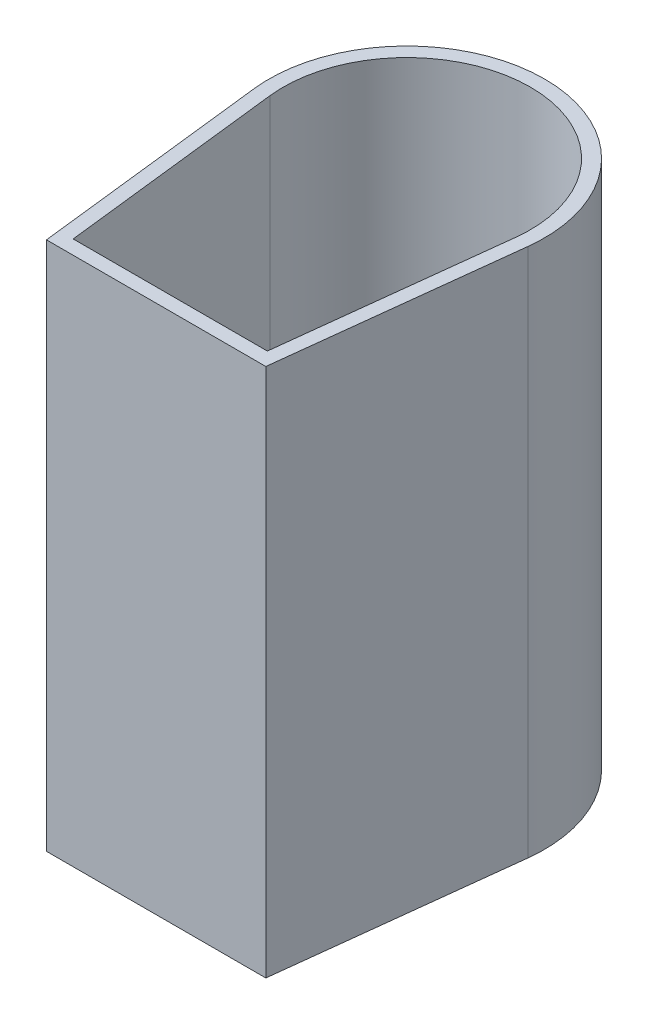
ISO-10303-21;
HEADER;
FILE_DESCRIPTION(('STEP AP214'),'2;1');
FILE_NAME('part.step','',(''),(''),'','','');
FILE_SCHEMA(('AUTOMOTIVE_DESIGN { 1 0 10303 214 1 1 1 1 }'));
ENDSEC;
DATA;
#1=APPLICATION_CONTEXT('core data for automotive mechanical design processes');
#2=APPLICATION_PROTOCOL_DEFINITION('international standard','automotive_design',2000,#1);
#3=PRODUCT_CONTEXT('',#1,'mechanical');
#4=PRODUCT('Part','Part','',(#3));
#5=PRODUCT_RELATED_PRODUCT_CATEGORY('part','',(#4));
#6=PRODUCT_DEFINITION_FORMATION('','',#4);
#7=PRODUCT_DEFINITION_CONTEXT('part definition',#1,'design');
#8=PRODUCT_DEFINITION('design','',#6,#7);
#9=PRODUCT_DEFINITION_SHAPE('','',#8);
#10=(LENGTH_UNIT() NAMED_UNIT(*) SI_UNIT(.MILLI.,.METRE.));
#11=(NAMED_UNIT(*) PLANE_ANGLE_UNIT() SI_UNIT($,.RADIAN.));
#12=(NAMED_UNIT(*) SI_UNIT($,.STERADIAN.) SOLID_ANGLE_UNIT());
#13=UNCERTAINTY_MEASURE_WITH_UNIT(LENGTH_MEASURE(1.E-05),#10,'distance_accuracy_value','');
#14=(GEOMETRIC_REPRESENTATION_CONTEXT(3) GLOBAL_UNCERTAINTY_ASSIGNED_CONTEXT((#13)) GLOBAL_UNIT_ASSIGNED_CONTEXT((#10,
#11,#12)) REPRESENTATION_CONTEXT('',''));
#15=CARTESIAN_POINT('',(0.,0.,0.));
#16=DIRECTION('',(0.,0.,1.));
#17=DIRECTION('',(1.,0.,0.));
#18=AXIS2_PLACEMENT_3D('',#15,#16,#17);
#19=CARTESIAN_POINT('',(27.5,150.,67.));
#20=DIRECTION('',(-0.993406334161437,0.,-0.114646653888962));
#21=DIRECTION('',(-0.114646653888962,0.,0.993406334161437));
#22=AXIS2_PLACEMENT_3D('',#19,#20,#21);
#23=PLANE('',#22);
#24=DIRECTION('',(0.,-1.,0.));
#25=VECTOR('',#24,1.);
#26=CARTESIAN_POINT('',(34.7692216956503,150.,4.01263288611368));
#27=LINE('',#26,#25);
#28=CARTESIAN_POINT('',(34.7692216956503,150.,4.01263288611368));
#29=VERTEX_POINT('',#28);
#30=CARTESIAN_POINT('',(34.7692216956503,5.,4.0126328861137));
#31=VERTEX_POINT('',#30);
#32=EDGE_CURVE('E115',#29,#31,#27,.T.);
#33=ORIENTED_EDGE('',*,*,#32,.T.);
#34=DIRECTION('',(-0.114646653888963,0.,0.993406334161437));
#35=VECTOR('',#34,1.);
#36=CARTESIAN_POINT('',(34.7692216956503,5.,4.01263288611369));
#37=LINE('',#36,#35);
#38=CARTESIAN_POINT('',(27.5,5.,67.));
#39=VERTEX_POINT('',#38);
#40=EDGE_CURVE('E99',#31,#39,#37,.T.);
#41=ORIENTED_EDGE('',*,*,#40,.T.);
#42=DIRECTION('',(0.,-1.,0.));
#43=VECTOR('',#42,1.);
#44=CARTESIAN_POINT('',(27.5,150.,67.));
#45=LINE('',#44,#43);
#46=CARTESIAN_POINT('',(27.5,150.,67.));
#47=VERTEX_POINT('',#46);
#48=EDGE_CURVE('E117',#47,#39,#45,.T.);
#49=ORIENTED_EDGE('',*,*,#48,.F.);
#50=DIRECTION('',(0.114646653888962,0.,-0.993406334161437));
#51=VECTOR('',#50,1.);
#52=CARTESIAN_POINT('',(27.5,150.,67.));
#53=LINE('',#52,#51);
#54=EDGE_CURVE('E176',#47,#29,#53,.T.);
#55=ORIENTED_EDGE('',*,*,#54,.T.);
#56=EDGE_LOOP('',(#33,#41,#49,#55));
#57=FACE_BOUND('',#56,.T.);
#58=ADVANCED_FACE('F33',(#57),#23,.T.);
#59=CARTESIAN_POINT('',(0.,150.,0.));
#60=DIRECTION('',(0.,-1.,0.));
#61=DIRECTION('',(0.,0.,-1.));
#62=AXIS2_PLACEMENT_3D('',#59,#60,#61);
#63=CYLINDRICAL_SURFACE('',#62,35.);
#64=DIRECTION('',(0.,-1.,0.));
#65=VECTOR('',#64,1.);
#66=CARTESIAN_POINT('',(-34.7692216956503,150.,4.01263288611369));
#67=LINE('',#66,#65);
#68=CARTESIAN_POINT('',(-34.7692216956503,150.,4.01263288611369));
#69=VERTEX_POINT('',#68);
#70=CARTESIAN_POINT('',(-34.7692216956503,5.,4.01263288611369));
#71=VERTEX_POINT('',#70);
#72=EDGE_CURVE('E108',#69,#71,#67,.T.);
#73=ORIENTED_EDGE('',*,*,#72,.T.);
#74=CARTESIAN_POINT('',(0.,5.,0.));
#75=DIRECTION('',(0.,-1.,0.));
#76=DIRECTION('',(0.,0.,-1.));
#77=AXIS2_PLACEMENT_3D('',#74,#75,#76);
#78=CIRCLE('',#77,35.);
#79=EDGE_CURVE('E96',#71,#31,#78,.T.);
#80=ORIENTED_EDGE('',*,*,#79,.T.);
#81=ORIENTED_EDGE('',*,*,#32,.F.);
#82=CARTESIAN_POINT('',(0.,150.,0.));
#83=DIRECTION('',(0.,1.,0.));
#84=DIRECTION('',(0.,0.,1.));
#85=AXIS2_PLACEMENT_3D('',#82,#83,#84);
#86=CIRCLE('',#85,35.);
#87=EDGE_CURVE('E114',#29,#69,#86,.T.);
#88=ORIENTED_EDGE('',*,*,#87,.T.);
#89=EDGE_LOOP('',(#73,#80,#81,#88));
#90=FACE_BOUND('',#89,.T.);
#91=ADVANCED_FACE('F112',(#90),#63,.F.);
#92=CARTESIAN_POINT('',(-27.5,150.,67.));
#93=DIRECTION('',(0.993406334161437,0.,-0.114646653888963));
#94=DIRECTION('',(-0.114646653888963,0.,-0.993406334161437));
#95=AXIS2_PLACEMENT_3D('',#92,#93,#94);
#96=PLANE('',#95);
#97=DIRECTION('',(0.,-1.,0.));
#98=VECTOR('',#97,1.);
#99=CARTESIAN_POINT('',(-27.5,150.,67.));
#100=LINE('',#99,#98);
#101=CARTESIAN_POINT('',(-27.5,150.,67.));
#102=VERTEX_POINT('',#101);
#103=CARTESIAN_POINT('',(-27.5,5.,67.));
#104=VERTEX_POINT('',#103);
#105=EDGE_CURVE('E55',#102,#104,#100,.T.);
#106=ORIENTED_EDGE('',*,*,#105,.T.);
#107=DIRECTION('',(-0.114646653888963,0.,-0.993406334161437));
#108=VECTOR('',#107,1.);
#109=CARTESIAN_POINT('',(-27.5,5.,67.));
#110=LINE('',#109,#108);
#111=EDGE_CURVE('E48',#104,#71,#110,.T.);
#112=ORIENTED_EDGE('',*,*,#111,.T.);
#113=ORIENTED_EDGE('',*,*,#72,.F.);
#114=DIRECTION('',(0.114646653888963,0.,0.993406334161437));
#115=VECTOR('',#114,1.);
#116=CARTESIAN_POINT('',(-27.5,150.,67.));
#117=LINE('',#116,#115);
#118=EDGE_CURVE('E119',#69,#102,#117,.T.);
#119=ORIENTED_EDGE('',*,*,#118,.T.);
#120=EDGE_LOOP('',(#106,#112,#113,#119));
#121=FACE_BOUND('',#120,.T.);
#122=ADVANCED_FACE('F107',(#121),#96,.T.);
#123=CARTESIAN_POINT('',(0.,150.,67.));
#124=DIRECTION('',(0.,0.,-1.));
#125=DIRECTION('',(-1.,0.,0.));
#126=AXIS2_PLACEMENT_3D('',#123,#124,#125);
#127=PLANE('',#126);
#128=ORIENTED_EDGE('',*,*,#48,.T.);
#129=DIRECTION('',(-1.,0.,0.));
#130=VECTOR('',#129,1.);
#131=CARTESIAN_POINT('',(-27.5,5.,67.));
#132=LINE('',#131,#130);
#133=EDGE_CURVE('E110',#39,#104,#132,.T.);
#134=ORIENTED_EDGE('',*,*,#133,.T.);
#135=ORIENTED_EDGE('',*,*,#105,.F.);
#136=DIRECTION('',(1.,0.,0.));
#137=VECTOR('',#136,1.);
#138=CARTESIAN_POINT('',(0.,150.,67.));
#139=LINE('',#138,#137);
#140=EDGE_CURVE('E178',#102,#47,#139,.T.);
#141=ORIENTED_EDGE('',*,*,#140,.T.);
#142=EDGE_LOOP('',(#128,#134,#135,#141));
#143=FACE_BOUND('',#142,.T.);
#144=ADVANCED_FACE('F172',(#143),#127,.T.);
#145=CARTESIAN_POINT('',(0.,150.,0.));
#146=DIRECTION('',(0.,1.,0.));
#147=DIRECTION('',(0.,0.,1.));
#148=AXIS2_PLACEMENT_3D('',#145,#146,#147);
#149=PLANE('',#148);
#150=CARTESIAN_POINT('',(0.,150.,0.));
#151=DIRECTION('',(0.,1.,0.));
#152=DIRECTION('',(0.,0.,1.));
#153=AXIS2_PLACEMENT_3D('',#150,#151,#152);
#154=CIRCLE('',#153,39.);
#155=CARTESIAN_POINT('',(38.742847032296,150.,4.47121950166956));
#156=VERTEX_POINT('',#155);
#157=CARTESIAN_POINT('',(-38.7428470322961,150.,4.4712195016695));
#158=VERTEX_POINT('',#157);
#159=EDGE_CURVE('E126',#156,#158,#154,.T.);
#160=ORIENTED_EDGE('',*,*,#159,.T.);
#161=DIRECTION('',(0.114646653888963,0.,0.993406334161437));
#162=VECTOR('',#161,1.);
#163=CARTESIAN_POINT('',(-31.0649192708576,150.,71.));
#164=LINE('',#163,#162);
#165=CARTESIAN_POINT('',(-31.0649192708576,150.,71.));
#166=VERTEX_POINT('',#165);
#167=EDGE_CURVE('E129',#158,#166,#164,.T.);
#168=ORIENTED_EDGE('',*,*,#167,.T.);
#169=DIRECTION('',(1.,0.,0.));
#170=VECTOR('',#169,1.);
#171=CARTESIAN_POINT('',(0.,150.,71.));
#172=LINE('',#171,#170);
#173=CARTESIAN_POINT('',(31.0649192708577,150.,71.));
#174=VERTEX_POINT('',#173);
#175=EDGE_CURVE('E132',#166,#174,#172,.T.);
#176=ORIENTED_EDGE('',*,*,#175,.T.);
#177=DIRECTION('',(0.114646653888962,0.,-0.993406334161437));
#178=VECTOR('',#177,1.);
#179=CARTESIAN_POINT('',(31.0649192708577,150.,71.));
#180=LINE('',#179,#178);
#181=EDGE_CURVE('E134',#174,#156,#180,.T.);
#182=ORIENTED_EDGE('',*,*,#181,.T.);
#183=EDGE_LOOP('',(#160,#168,#176,#182));
#184=FACE_BOUND('',#183,.T.);
#185=ORIENTED_EDGE('',*,*,#87,.F.);
#186=ORIENTED_EDGE('',*,*,#54,.F.);
#187=ORIENTED_EDGE('',*,*,#140,.F.);
#188=ORIENTED_EDGE('',*,*,#118,.F.);
#189=EDGE_LOOP('',(#185,#186,#187,#188));
#190=FACE_BOUND('',#189,.T.);
#191=ADVANCED_FACE('F169',(#184,#190),#149,.T.);
#192=CARTESIAN_POINT('',(0.,0.,0.));
#193=DIRECTION('',(0.,1.,0.));
#194=DIRECTION('',(0.,0.,1.));
#195=AXIS2_PLACEMENT_3D('',#192,#193,#194);
#196=PLANE('',#195);
#197=CARTESIAN_POINT('',(-24.,0.,0.));
#198=DIRECTION('',(0.,-1.,0.));
#199=DIRECTION('',(0.,0.,1.));
#200=AXIS2_PLACEMENT_3D('',#197,#198,#199);
#201=CIRCLE('',#200,3.25);
#202=CARTESIAN_POINT('',(-24.,0.,3.25));
#203=VERTEX_POINT('',#202);
#204=EDGE_CURVE('E199',#203,#203,#201,.T.);
#205=ORIENTED_EDGE('',*,*,#204,.F.);
#206=EDGE_LOOP('',(#205));
#207=FACE_BOUND('',#206,.T.);
#208=CARTESIAN_POINT('',(24.,0.,0.));
#209=DIRECTION('',(0.,-1.,0.));
#210=DIRECTION('',(0.,0.,-1.));
#211=AXIS2_PLACEMENT_3D('',#208,#209,#210);
#212=CIRCLE('',#211,3.25);
#213=CARTESIAN_POINT('',(24.,0.,-3.25));
#214=VERTEX_POINT('',#213);
#215=EDGE_CURVE('E193',#214,#214,#212,.T.);
#216=ORIENTED_EDGE('',*,*,#215,.F.);
#217=EDGE_LOOP('',(#216));
#218=FACE_BOUND('',#217,.T.);
#219=CARTESIAN_POINT('',(0.,0.,0.));
#220=DIRECTION('',(0.,-1.,0.));
#221=DIRECTION('',(0.,0.,-1.));
#222=AXIS2_PLACEMENT_3D('',#219,#220,#221);
#223=CIRCLE('',#222,6.25);
#224=CARTESIAN_POINT('',(0.,0.,-6.25));
#225=VERTEX_POINT('',#224);
#226=EDGE_CURVE('E187',#225,#225,#223,.T.);
#227=ORIENTED_EDGE('',*,*,#226,.F.);
#228=EDGE_LOOP('',(#227));
#229=FACE_BOUND('',#228,.T.);
#230=CARTESIAN_POINT('',(0.,0.,0.));
#231=DIRECTION('',(0.,1.,0.));
#232=DIRECTION('',(0.,0.,1.));
#233=AXIS2_PLACEMENT_3D('',#230,#231,#232);
#234=CIRCLE('',#233,39.);
#235=CARTESIAN_POINT('',(38.742847032296,0.,4.47121950166956));
#236=VERTEX_POINT('',#235);
#237=CARTESIAN_POINT('',(-38.7428470322961,0.,4.4712195016695));
#238=VERTEX_POINT('',#237);
#239=EDGE_CURVE('E125',#236,#238,#234,.T.);
#240=ORIENTED_EDGE('',*,*,#239,.F.);
#241=DIRECTION('',(0.114646653888962,0.,-0.993406334161437));
#242=VECTOR('',#241,1.);
#243=CARTESIAN_POINT('',(31.0649192708577,0.,71.));
#244=LINE('',#243,#242);
#245=CARTESIAN_POINT('',(31.0649192708577,0.,71.));
#246=VERTEX_POINT('',#245);
#247=EDGE_CURVE('E130',#246,#236,#244,.T.);
#248=ORIENTED_EDGE('',*,*,#247,.F.);
#249=DIRECTION('',(1.,0.,0.));
#250=VECTOR('',#249,1.);
#251=CARTESIAN_POINT('',(0.,0.,71.));
#252=LINE('',#251,#250);
#253=CARTESIAN_POINT('',(-31.0649192708576,0.,71.));
#254=VERTEX_POINT('',#253);
#255=EDGE_CURVE('E142',#254,#246,#252,.T.);
#256=ORIENTED_EDGE('',*,*,#255,.F.);
#257=DIRECTION('',(0.114646653888963,0.,0.993406334161437));
#258=VECTOR('',#257,1.);
#259=CARTESIAN_POINT('',(-31.0649192708576,0.,71.));
#260=LINE('',#259,#258);
#261=EDGE_CURVE('E139',#238,#254,#260,.T.);
#262=ORIENTED_EDGE('',*,*,#261,.F.);
#263=EDGE_LOOP('',(#240,#248,#256,#262));
#264=FACE_BOUND('',#263,.T.);
#265=ADVANCED_FACE('F160',(#207,#218,#229,#264),#196,.F.);
#266=CARTESIAN_POINT('',(0.,150.,0.));
#267=DIRECTION('',(0.,-1.,0.));
#268=DIRECTION('',(0.,0.,-1.));
#269=AXIS2_PLACEMENT_3D('',#266,#267,#268);
#270=CYLINDRICAL_SURFACE('',#269,39.);
#271=ORIENTED_EDGE('',*,*,#239,.T.);
#272=DIRECTION('',(0.,-1.,0.));
#273=VECTOR('',#272,1.);
#274=CARTESIAN_POINT('',(-38.7428470322961,150.,4.4712195016695));
#275=LINE('',#274,#273);
#276=EDGE_CURVE('E11',#158,#238,#275,.T.);
#277=ORIENTED_EDGE('',*,*,#276,.F.);
#278=ORIENTED_EDGE('',*,*,#159,.F.);
#279=DIRECTION('',(0.,-1.,0.));
#280=VECTOR('',#279,1.);
#281=CARTESIAN_POINT('',(38.742847032296,150.,4.47121950166956));
#282=LINE('',#281,#280);
#283=EDGE_CURVE('E136',#156,#236,#282,.T.);
#284=ORIENTED_EDGE('',*,*,#283,.T.);
#285=EDGE_LOOP('',(#271,#277,#278,#284));
#286=FACE_BOUND('',#285,.T.);
#287=ADVANCED_FACE('F35',(#286),#270,.T.);
#288=CARTESIAN_POINT('',(-31.0649192708576,150.,71.));
#289=DIRECTION('',(0.993406334161437,0.,-0.114646653888963));
#290=DIRECTION('',(-0.114646653888963,0.,-0.993406334161437));
#291=AXIS2_PLACEMENT_3D('',#288,#289,#290);
#292=PLANE('',#291);
#293=ORIENTED_EDGE('',*,*,#261,.T.);
#294=DIRECTION('',(0.,-1.,0.));
#295=VECTOR('',#294,1.);
#296=CARTESIAN_POINT('',(-31.0649192708576,150.,71.));
#297=LINE('',#296,#295);
#298=EDGE_CURVE('E41',#166,#254,#297,.T.);
#299=ORIENTED_EDGE('',*,*,#298,.F.);
#300=ORIENTED_EDGE('',*,*,#167,.F.);
#301=ORIENTED_EDGE('',*,*,#276,.T.);
#302=EDGE_LOOP('',(#293,#299,#300,#301));
#303=FACE_BOUND('',#302,.T.);
#304=ADVANCED_FACE('F156',(#303),#292,.F.);
#305=CARTESIAN_POINT('',(0.,150.,71.));
#306=DIRECTION('',(0.,0.,-1.));
#307=DIRECTION('',(-1.,0.,0.));
#308=AXIS2_PLACEMENT_3D('',#305,#306,#307);
#309=PLANE('',#308);
#310=ORIENTED_EDGE('',*,*,#255,.T.);
#311=DIRECTION('',(0.,-1.,0.));
#312=VECTOR('',#311,1.);
#313=CARTESIAN_POINT('',(31.0649192708577,150.,71.));
#314=LINE('',#313,#312);
#315=EDGE_CURVE('E147',#174,#246,#314,.T.);
#316=ORIENTED_EDGE('',*,*,#315,.F.);
#317=ORIENTED_EDGE('',*,*,#175,.F.);
#318=ORIENTED_EDGE('',*,*,#298,.T.);
#319=EDGE_LOOP('',(#310,#316,#317,#318));
#320=FACE_BOUND('',#319,.T.);
#321=ADVANCED_FACE('F153',(#320),#309,.F.);
#322=CARTESIAN_POINT('',(31.0649192708577,150.,71.));
#323=DIRECTION('',(-0.993406334161437,0.,-0.114646653888962));
#324=DIRECTION('',(-0.114646653888962,0.,0.993406334161437));
#325=AXIS2_PLACEMENT_3D('',#322,#323,#324);
#326=PLANE('',#325);
#327=ORIENTED_EDGE('',*,*,#247,.T.);
#328=ORIENTED_EDGE('',*,*,#283,.F.);
#329=ORIENTED_EDGE('',*,*,#181,.F.);
#330=ORIENTED_EDGE('',*,*,#315,.T.);
#331=EDGE_LOOP('',(#327,#328,#329,#330));
#332=FACE_BOUND('',#331,.T.);
#333=ADVANCED_FACE('F164',(#332),#326,.F.);
#334=CARTESIAN_POINT('',(0.,5.,0.));
#335=DIRECTION('',(0.,-1.,0.));
#336=DIRECTION('',(0.,0.,-1.));
#337=AXIS2_PLACEMENT_3D('',#334,#335,#336);
#338=PLANE('',#337);
#339=CARTESIAN_POINT('',(-24.,5.,0.));
#340=DIRECTION('',(0.,-1.,0.));
#341=DIRECTION('',(0.,0.,-1.));
#342=AXIS2_PLACEMENT_3D('',#339,#340,#341);
#343=CIRCLE('',#342,3.25);
#344=CARTESIAN_POINT('',(-24.,5.,-3.25));
#345=VERTEX_POINT('',#344);
#346=EDGE_CURVE('E196',#345,#345,#343,.F.);
#347=ORIENTED_EDGE('',*,*,#346,.F.);
#348=EDGE_LOOP('',(#347));
#349=FACE_BOUND('',#348,.T.);
#350=CARTESIAN_POINT('',(24.,5.,0.));
#351=DIRECTION('',(0.,-1.,0.));
#352=DIRECTION('',(0.,0.,-1.));
#353=AXIS2_PLACEMENT_3D('',#350,#351,#352);
#354=CIRCLE('',#353,3.25);
#355=CARTESIAN_POINT('',(24.,5.,-3.25));
#356=VERTEX_POINT('',#355);
#357=EDGE_CURVE('E190',#356,#356,#354,.F.);
#358=ORIENTED_EDGE('',*,*,#357,.F.);
#359=EDGE_LOOP('',(#358));
#360=FACE_BOUND('',#359,.T.);
#361=CARTESIAN_POINT('',(0.,5.,0.));
#362=DIRECTION('',(0.,-1.,0.));
#363=DIRECTION('',(0.,0.,-1.));
#364=AXIS2_PLACEMENT_3D('',#361,#362,#363);
#365=CIRCLE('',#364,6.25);
#366=CARTESIAN_POINT('',(0.,5.,-6.25));
#367=VERTEX_POINT('',#366);
#368=EDGE_CURVE('E184',#367,#367,#365,.F.);
#369=ORIENTED_EDGE('',*,*,#368,.F.);
#370=EDGE_LOOP('',(#369));
#371=FACE_BOUND('',#370,.T.);
#372=ORIENTED_EDGE('',*,*,#133,.F.);
#373=ORIENTED_EDGE('',*,*,#40,.F.);
#374=ORIENTED_EDGE('',*,*,#79,.F.);
#375=ORIENTED_EDGE('',*,*,#111,.F.);
#376=EDGE_LOOP('',(#372,#373,#374,#375));
#377=FACE_BOUND('',#376,.T.);
#378=ADVANCED_FACE('F97',(#349,#360,#371,#377),#338,.F.);
#379=CARTESIAN_POINT('',(0.,150.001,0.));
#380=DIRECTION('',(0.,-1.,0.));
#381=DIRECTION('',(0.,0.,-1.));
#382=AXIS2_PLACEMENT_3D('',#379,#380,#381);
#383=CYLINDRICAL_SURFACE('',#382,6.25);
#384=ORIENTED_EDGE('',*,*,#226,.T.);
#385=EDGE_LOOP('',(#384));
#386=FACE_BOUND('',#385,.T.);
#387=ORIENTED_EDGE('',*,*,#368,.T.);
#388=EDGE_LOOP('',(#387));
#389=FACE_BOUND('',#388,.T.);
#390=ADVANCED_FACE('F213',(#386,#389),#383,.F.);
#391=CARTESIAN_POINT('',(24.,150.001,0.));
#392=DIRECTION('',(0.,-1.,0.));
#393=DIRECTION('',(0.,0.,-1.));
#394=AXIS2_PLACEMENT_3D('',#391,#392,#393);
#395=CYLINDRICAL_SURFACE('',#394,3.25);
#396=ORIENTED_EDGE('',*,*,#215,.T.);
#397=EDGE_LOOP('',(#396));
#398=FACE_BOUND('',#397,.T.);
#399=ORIENTED_EDGE('',*,*,#357,.T.);
#400=EDGE_LOOP('',(#399));
#401=FACE_BOUND('',#400,.T.);
#402=ADVANCED_FACE('F216',(#398,#401),#395,.F.);
#403=CARTESIAN_POINT('',(-24.,150.001,0.));
#404=DIRECTION('',(0.,-1.,0.));
#405=DIRECTION('',(0.,0.,-1.));
#406=AXIS2_PLACEMENT_3D('',#403,#404,#405);
#407=CYLINDRICAL_SURFACE('',#406,3.25);
#408=ORIENTED_EDGE('',*,*,#204,.T.);
#409=EDGE_LOOP('',(#408));
#410=FACE_BOUND('',#409,.T.);
#411=ORIENTED_EDGE('',*,*,#346,.T.);
#412=EDGE_LOOP('',(#411));
#413=FACE_BOUND('',#412,.T.);
#414=ADVANCED_FACE('F203',(#410,#413),#407,.F.);
#415=CLOSED_SHELL('',(#58,#91,#122,#144,#191,#265,#287,#304,#321,#333,#378,#390,#402,#414));
#416=MANIFOLD_SOLID_BREP('B2',#415);
#417=ADVANCED_BREP_SHAPE_REPRESENTATION('',(#18,#416),#14);
#418=SHAPE_DEFINITION_REPRESENTATION(#9,#417);
ENDSEC;
END-ISO-10303-21;
